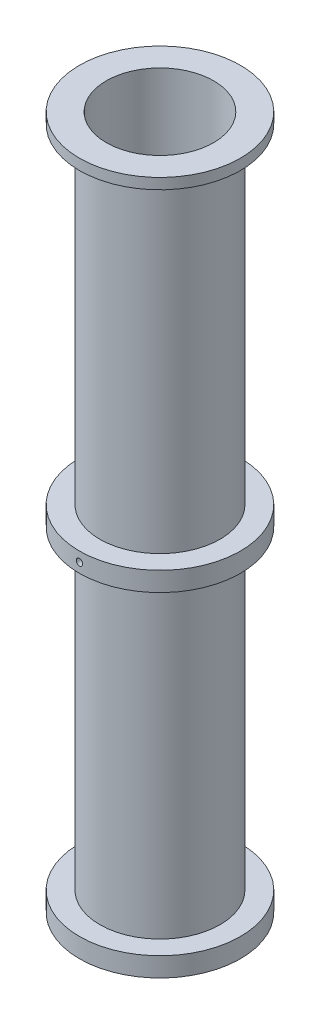
ISO-10303-21;
HEADER;
FILE_DESCRIPTION(('STEP AP214'),'2;1');
FILE_NAME('part.step','',(''),(''),'','','');
FILE_SCHEMA(('AUTOMOTIVE_DESIGN { 1 0 10303 214 1 1 1 1 }'));
ENDSEC;
DATA;
#1=APPLICATION_CONTEXT('core data for automotive mechanical design processes');
#2=APPLICATION_PROTOCOL_DEFINITION('international standard','automotive_design',2000,#1);
#3=PRODUCT_CONTEXT('',#1,'mechanical');
#4=PRODUCT('Part','Part','',(#3));
#5=PRODUCT_RELATED_PRODUCT_CATEGORY('part','',(#4));
#6=PRODUCT_DEFINITION_FORMATION('','',#4);
#7=PRODUCT_DEFINITION_CONTEXT('part definition',#1,'design');
#8=PRODUCT_DEFINITION('design','',#6,#7);
#9=PRODUCT_DEFINITION_SHAPE('','',#8);
#10=(LENGTH_UNIT() NAMED_UNIT(*) SI_UNIT(.MILLI.,.METRE.));
#11=(NAMED_UNIT(*) PLANE_ANGLE_UNIT() SI_UNIT($,.RADIAN.));
#12=(NAMED_UNIT(*) SI_UNIT($,.STERADIAN.) SOLID_ANGLE_UNIT());
#13=UNCERTAINTY_MEASURE_WITH_UNIT(LENGTH_MEASURE(1.E-05),#10,'distance_accuracy_value','');
#14=(GEOMETRIC_REPRESENTATION_CONTEXT(3) GLOBAL_UNCERTAINTY_ASSIGNED_CONTEXT((#13)) GLOBAL_UNIT_ASSIGNED_CONTEXT((#10,
#11,#12)) REPRESENTATION_CONTEXT('',''));
#15=CARTESIAN_POINT('',(0.,0.,0.));
#16=DIRECTION('',(0.,0.,1.));
#17=DIRECTION('',(1.,0.,0.));
#18=AXIS2_PLACEMENT_3D('',#15,#16,#17);
#19=CARTESIAN_POINT('',(0.,0.,0.));
#20=DIRECTION('',(0.,-1.,0.));
#21=DIRECTION('',(0.,0.,-1.));
#22=AXIS2_PLACEMENT_3D('',#19,#20,#21);
#23=PLANE('',#22);
#24=CARTESIAN_POINT('',(0.,0.,0.));
#25=DIRECTION('',(0.,1.,0.));
#26=DIRECTION('',(0.,0.,1.));
#27=AXIS2_PLACEMENT_3D('',#24,#25,#26);
#28=CIRCLE('',#27,37.5);
#29=CARTESIAN_POINT('',(0.,0.,37.5));
#30=VERTEX_POINT('',#29);
#31=EDGE_CURVE('E10',#30,#30,#28,.T.);
#32=ORIENTED_EDGE('',*,*,#31,.F.);
#33=EDGE_LOOP('',(#32));
#34=FACE_BOUND('',#33,.T.);
#35=ADVANCED_FACE('F34',(#34),#23,.T.);
#36=CARTESIAN_POINT('',(0.,3.,0.));
#37=DIRECTION('',(0.,1.,0.));
#38=DIRECTION('',(0.,0.,1.));
#39=AXIS2_PLACEMENT_3D('',#36,#37,#38);
#40=CYLINDRICAL_SURFACE('',#39,37.5);
#41=ORIENTED_EDGE('',*,*,#31,.T.);
#42=EDGE_LOOP('',(#41));
#43=FACE_BOUND('',#42,.T.);
#44=CARTESIAN_POINT('',(0.,8.99999999999999,0.));
#45=DIRECTION('',(0.,1.,0.));
#46=DIRECTION('',(0.,0.,1.));
#47=AXIS2_PLACEMENT_3D('',#44,#45,#46);
#48=CIRCLE('',#47,37.5);
#49=CARTESIAN_POINT('',(0.,8.99999999999999,37.5));
#50=VERTEX_POINT('',#49);
#51=EDGE_CURVE('E40',#50,#50,#48,.T.);
#52=ORIENTED_EDGE('',*,*,#51,.F.);
#53=EDGE_LOOP('',(#52));
#54=FACE_BOUND('',#53,.T.);
#55=ADVANCED_FACE('F178',(#43,#54),#40,.T.);
#56=CARTESIAN_POINT('',(0.,8.99999999999999,37.5));
#57=DIRECTION('',(0.,1.,0.));
#58=DIRECTION('',(0.,0.,1.));
#59=AXIS2_PLACEMENT_3D('',#56,#57,#58);
#60=PLANE('',#59);
#61=ORIENTED_EDGE('',*,*,#51,.T.);
#62=EDGE_LOOP('',(#61));
#63=FACE_BOUND('',#62,.T.);
#64=CARTESIAN_POINT('',(0.,8.99999999999999,0.));
#65=DIRECTION('',(0.,1.,0.));
#66=DIRECTION('',(0.,0.,1.));
#67=AXIS2_PLACEMENT_3D('',#64,#65,#66);
#68=CIRCLE('',#67,28.);
#69=CARTESIAN_POINT('',(0.,8.99999999999999,28.));
#70=VERTEX_POINT('',#69);
#71=EDGE_CURVE('E44',#70,#70,#68,.T.);
#72=ORIENTED_EDGE('',*,*,#71,.F.);
#73=EDGE_LOOP('',(#72));
#74=FACE_BOUND('',#73,.T.);
#75=ADVANCED_FACE('F183',(#63,#74),#60,.T.);
#76=CARTESIAN_POINT('',(0.,3.,0.));
#77=DIRECTION('',(0.,1.,0.));
#78=DIRECTION('',(0.,0.,1.));
#79=AXIS2_PLACEMENT_3D('',#76,#77,#78);
#80=CYLINDRICAL_SURFACE('',#79,28.);
#81=ORIENTED_EDGE('',*,*,#71,.T.);
#82=EDGE_LOOP('',(#81));
#83=FACE_BOUND('',#82,.T.);
#84=CARTESIAN_POINT('',(0.,155.5,0.));
#85=DIRECTION('',(0.,1.,0.));
#86=DIRECTION('',(0.,0.,1.));
#87=AXIS2_PLACEMENT_3D('',#84,#85,#86);
#88=CIRCLE('',#87,28.);
#89=CARTESIAN_POINT('',(0.,155.5,28.));
#90=VERTEX_POINT('',#89);
#91=EDGE_CURVE('E48',#90,#90,#88,.T.);
#92=ORIENTED_EDGE('',*,*,#91,.F.);
#93=EDGE_LOOP('',(#92));
#94=FACE_BOUND('',#93,.T.);
#95=ADVANCED_FACE('F187',(#83,#94),#80,.T.);
#96=CARTESIAN_POINT('',(0.,155.5,37.5));
#97=DIRECTION('',(0.,-1.,0.));
#98=DIRECTION('',(0.,0.,-1.));
#99=AXIS2_PLACEMENT_3D('',#96,#97,#98);
#100=PLANE('',#99);
#101=ORIENTED_EDGE('',*,*,#91,.T.);
#102=EDGE_LOOP('',(#101));
#103=FACE_BOUND('',#102,.T.);
#104=CARTESIAN_POINT('',(0.,155.5,0.));
#105=DIRECTION('',(0.,1.,0.));
#106=DIRECTION('',(0.,0.,1.));
#107=AXIS2_PLACEMENT_3D('',#104,#105,#106);
#108=CIRCLE('',#107,37.5);
#109=CARTESIAN_POINT('',(0.,155.5,37.5));
#110=VERTEX_POINT('',#109);
#111=EDGE_CURVE('E53',#110,#110,#108,.T.);
#112=ORIENTED_EDGE('',*,*,#111,.F.);
#113=EDGE_LOOP('',(#112));
#114=FACE_BOUND('',#113,.T.);
#115=ADVANCED_FACE('F127',(#103,#114),#100,.T.);
#116=CARTESIAN_POINT('',(0.,3.,0.));
#117=DIRECTION('',(0.,1.,0.));
#118=DIRECTION('',(0.,0.,1.));
#119=AXIS2_PLACEMENT_3D('',#116,#117,#118);
#120=CYLINDRICAL_SURFACE('',#119,37.5);
#121=CARTESIAN_POINT('',(0.,158.5,37.5));
#122=CARTESIAN_POINT('',(-0.0842195205141671,158.500003723576,37.4999995970403));
#123=CARTESIAN_POINT('',(-0.1684992501374,158.507116742075,37.4997132414617));
#124=CARTESIAN_POINT('',(-0.334735123578592,158.535391889686,37.49859844096));
#125=CARTESIAN_POINT('',(-0.416688387770324,158.55657070054,37.4977693523835));
#126=CARTESIAN_POINT('',(-0.5758390943498,158.612371334294,37.4956629547055));
#127=CARTESIAN_POINT('',(-0.653038883672903,158.646986460603,37.494385868914));
#128=CARTESIAN_POINT('',(-0.800510699850159,158.72866721925,37.4915274322161));
#129=CARTESIAN_POINT('',(-0.870784387851939,158.775729856169,37.4899461545366));
#130=CARTESIAN_POINT('',(-1.00247959646428,158.881007024338,37.4866560761337));
#131=CARTESIAN_POINT('',(-1.06389574767865,158.939228270501,37.4849471990047));
#132=CARTESIAN_POINT('',(-1.17608696497184,159.065157175771,37.4815951879592));
#133=CARTESIAN_POINT('',(-1.22686160254644,159.132865216703,37.4799520566921));
#134=CARTESIAN_POINT('',(-1.31634095076994,159.27587089146,37.476916346263));
#135=CARTESIAN_POINT('',(-1.35504182416198,159.351170928116,37.4755238468156));
#136=CARTESIAN_POINT('',(-1.41925034146144,159.507206113214,37.4731472754128));
#137=CARTESIAN_POINT('',(-1.4447580588977,159.587941231362,37.4721632011813));
#138=CARTESIAN_POINT('',(-1.48184297398315,159.752508621628,37.4707150888233));
#139=CARTESIAN_POINT('',(-1.49342768712381,159.836339197638,37.4702507701475));
#140=CARTESIAN_POINT('',(-1.50236092028189,160.004756366492,37.4698936828178));
#141=CARTESIAN_POINT('',(-1.49970952140344,160.089342955026,37.4700009109076));
#142=CARTESIAN_POINT('',(-1.4802520873987,160.256820030199,37.4707745642131));
#143=CARTESIAN_POINT('',(-1.46345416964689,160.339711461599,37.4714406687405));
#144=CARTESIAN_POINT('',(-1.41619309835374,160.501496961978,37.4732564860408));
#145=CARTESIAN_POINT('',(-1.38572990260151,160.58039101861,37.4744062003074));
#146=CARTESIAN_POINT('',(-1.31199371358753,160.731968418156,37.477060011414));
#147=CARTESIAN_POINT('',(-1.26871700804404,160.804649953326,37.4785642109282));
#148=CARTESIAN_POINT('',(-1.17058499130181,160.941719353547,37.4817573316246));
#149=CARTESIAN_POINT('',(-1.1157296294568,161.006107182319,37.4834462536147));
#150=CARTESIAN_POINT('',(-0.995951575481959,161.124808698738,37.4868198688846));
#151=CARTESIAN_POINT('',(-0.931021849917455,161.179115289523,37.488504558368));
#152=CARTESIAN_POINT('',(-0.792962951803446,161.276058106275,37.4916786663144));
#153=CARTESIAN_POINT('',(-0.719833777660065,161.318694329974,37.4931680847395));
#154=CARTESIAN_POINT('',(-0.567447811905341,161.391085386012,37.4957838089156));
#155=CARTESIAN_POINT('',(-0.488190909022632,161.420839984373,37.4969101080708));
#156=CARTESIAN_POINT('',(-0.325801101121311,161.466618588044,37.4986725418978));
#157=CARTESIAN_POINT('',(-0.242668214731312,161.482642659337,37.4993086789251));
#158=CARTESIAN_POINT('',(-0.0749479203356583,161.500496625732,37.500018784703));
#159=CARTESIAN_POINT('',(0.00963844090902377,161.502336339347,37.5000931423206));
#160=CARTESIAN_POINT('',(0.177918750101981,161.491794970416,37.4996723393137));
#161=CARTESIAN_POINT('',(0.261612699921769,161.4794139177,37.4991771798839));
#162=CARTESIAN_POINT('',(0.425704989343062,161.440790594783,37.497673383271));
#163=CARTESIAN_POINT('',(0.506104382512182,161.41455279371,37.4966649116469));
#164=CARTESIAN_POINT('',(0.661357713474356,161.348965300032,37.4942480862364));
#165=CARTESIAN_POINT('',(0.736211630990282,161.309615559487,37.492839730988));
#166=CARTESIAN_POINT('',(0.878294330894828,161.218895959408,37.4897807254159));
#167=CARTESIAN_POINT('',(0.945518898362466,161.167519503116,37.4881299423042));
#168=CARTESIAN_POINT('',(1.07039228732311,161.054214524942,37.4847725098235));
#169=CARTESIAN_POINT('',(1.12804106822738,160.992285958335,37.4830658602176));
#170=CARTESIAN_POINT('',(1.23215935801066,160.859592533953,37.4797879672503));
#171=CARTESIAN_POINT('',(1.27862252455697,160.788822697486,37.4782168010316));
#172=CARTESIAN_POINT('',(1.35900732485935,160.640480901288,37.4753882409257));
#173=CARTESIAN_POINT('',(1.39292899844216,160.56290896316,37.4741308460422));
#174=CARTESIAN_POINT('',(1.44725680335506,160.403188657132,37.472072157233));
#175=CARTESIAN_POINT('',(1.46766701149935,160.321041677776,37.4712707257398));
#176=CARTESIAN_POINT('',(1.49440586308033,160.154483595663,37.470213942613));
#177=CARTESIAN_POINT('',(1.50073454840028,160.070072499641,37.4699585893553));
#178=CARTESIAN_POINT('',(1.49913024560453,159.901445556699,37.4700228038771));
#179=CARTESIAN_POINT('',(1.49120724398331,159.817229614432,37.470341969078));
#180=CARTESIAN_POINT('',(1.4613450668606,159.651324384802,37.4715183952149));
#181=CARTESIAN_POINT('',(1.43940586398703,159.569635102374,37.4723756572015));
#182=CARTESIAN_POINT('',(1.3821358583777,159.411099324305,37.4745315659041));
#183=CARTESIAN_POINT('',(1.34680487429427,159.334252894262,37.4758302185971));
#184=CARTESIAN_POINT('',(1.26375649376227,159.187582925539,37.4787224740583));
#185=CARTESIAN_POINT('',(1.21603951547729,159.117759149879,37.4803160668684));
#186=CARTESIAN_POINT('',(1.10953987625872,158.987067904014,37.4836197988814));
#187=CARTESIAN_POINT('',(1.05075066767261,158.92620577149,37.4853300066618));
#188=CARTESIAN_POINT('',(0.923771927333156,158.815197203434,37.4886738914741));
#189=CARTESIAN_POINT('',(0.855580078196107,158.765053417349,37.490307549506));
#190=CARTESIAN_POINT('',(0.711693425952757,158.676889942843,37.4933150207665));
#191=CARTESIAN_POINT('',(0.635992790975171,158.638879776462,37.4946886295751));
#192=CARTESIAN_POINT('',(0.479336523753521,158.576153338983,37.4970178490855));
#193=CARTESIAN_POINT('',(0.398387260770486,158.55142128105,37.4979739559171));
#194=CARTESIAN_POINT('',(0.264108572909723,158.522478097612,37.4991060596921));
#195=CARTESIAN_POINT('',(0.211649948068835,158.514059485052,37.4994398246029));
#196=CARTESIAN_POINT('',(0.106135520704444,158.502819264339,37.4998869216816));
#197=CARTESIAN_POINT('',(0.0530797184995046,158.4999976532,37.5000002539671));
#198=CARTESIAN_POINT('',(0.,158.5,37.5));
#199=B_SPLINE_CURVE_WITH_KNOTS('',3,(#121,#122,#123,#124,#125,#126,#127,#128,#129,#130,#131,
#132,#133,#134,#135,#136,#137,#138,#139,#140,#141,#142,#143,#144,#145,#146,#147,#148,#149,#150,
#151,#152,#153,#154,#155,#156,#157,#158,#159,#160,#161,#162,#163,#164,#165,#166,#167,#168,#169,
#170,#171,#172,#173,#174,#175,#176,#177,#178,#179,#180,#181,#182,#183,#184,#185,#186,#187,#188,
#189,#190,#191,#192,#193,#194,#195,#196,#197,#198),.UNSPECIFIED.,.T.,.F.,(4,2,2,2,2,2,2,2,2,2,2,
2,2,2,2,2,2,2,2,2,2,2,2,2,2,2,2,2,2,2,2,2,2,2,2,2,2,2,4),(0.,0.252464808076155,
0.505229570212395,0.757868517098838,1.01044672316359,1.26317740309555,1.51591825783642,
1.76873935647587,2.02155904606319,2.27424220485604,2.52692392409683,2.7794607514579,
3.03199835888937,3.2846092022746,3.53722115062903,3.79001026067344,4.04279941985713,
4.29559317043277,4.54838570616527,4.80100324139001,5.05362024673577,5.30615582689219,
5.55869233040376,5.81136767831599,6.06404409721172,6.31686344998805,6.56968199990472,
6.82242423207415,7.07516571250095,7.32773015997397,7.58029510067838,7.83286346166716,
8.08542329680364,8.33813295687006,8.59090501169826,8.84387494828978,9.09654344971404,
9.25566057612588,9.41477761766092),.UNSPECIFIED.);
#200=CARTESIAN_POINT('',(0.,158.5,37.5));
#201=VERTEX_POINT('',#200);
#202=EDGE_CURVE('E106',#201,#201,#199,.T.);
#203=ORIENTED_EDGE('',*,*,#202,.T.);
#204=EDGE_LOOP('',(#203));
#205=FACE_BOUND('',#204,.T.);
#206=CARTESIAN_POINT('',(0.,161.5,-37.5));
#207=CARTESIAN_POINT('',(-0.0842195205141672,161.499996276424,-37.4999995970404));
#208=CARTESIAN_POINT('',(-0.1684992501374,161.492883257925,-37.4997132414617));
#209=CARTESIAN_POINT('',(-0.334735123578592,161.464608110314,-37.49859844096));
#210=CARTESIAN_POINT('',(-0.416688387770324,161.44342929946,-37.4977693523835));
#211=CARTESIAN_POINT('',(-0.5758390943498,161.387628665706,-37.4956629547055));
#212=CARTESIAN_POINT('',(-0.653038883672903,161.353013539397,-37.494385868914));
#213=CARTESIAN_POINT('',(-0.800510699850159,161.27133278075,-37.4915274322161));
#214=CARTESIAN_POINT('',(-0.870784387851939,161.224270143831,-37.4899461545366));
#215=CARTESIAN_POINT('',(-1.00247959646428,161.118992975662,-37.4866560761337));
#216=CARTESIAN_POINT('',(-1.06389574767865,161.060771729499,-37.4849471990048));
#217=CARTESIAN_POINT('',(-1.17608696497184,160.934842824229,-37.4815951879592));
#218=CARTESIAN_POINT('',(-1.22686160254644,160.867134783297,-37.4799520566921));
#219=CARTESIAN_POINT('',(-1.31634095076994,160.72412910854,-37.476916346263));
#220=CARTESIAN_POINT('',(-1.35504182416198,160.648829071884,-37.4755238468156));
#221=CARTESIAN_POINT('',(-1.41925034146144,160.492793886786,-37.4731472754129));
#222=CARTESIAN_POINT('',(-1.4447580588977,160.412058768638,-37.4721632011813));
#223=CARTESIAN_POINT('',(-1.48184297398315,160.247491378372,-37.4707150888233));
#224=CARTESIAN_POINT('',(-1.49342768712381,160.163660802362,-37.4702507701475));
#225=CARTESIAN_POINT('',(-1.50236092028189,159.995243633508,-37.4698936828178));
#226=CARTESIAN_POINT('',(-1.49970952140344,159.910657044974,-37.4700009109077));
#227=CARTESIAN_POINT('',(-1.4802520873987,159.743179969801,-37.4707745642131));
#228=CARTESIAN_POINT('',(-1.46345416964689,159.660288538401,-37.4714406687406));
#229=CARTESIAN_POINT('',(-1.41619309835375,159.498503038022,-37.4732564860408));
#230=CARTESIAN_POINT('',(-1.38572990260151,159.41960898139,-37.4744062003075));
#231=CARTESIAN_POINT('',(-1.31199371358753,159.268031581844,-37.477060011414));
#232=CARTESIAN_POINT('',(-1.26871700804404,159.195350046674,-37.4785642109283));
#233=CARTESIAN_POINT('',(-1.17058499130181,159.058280646453,-37.4817573316246));
#234=CARTESIAN_POINT('',(-1.1157296294568,158.993892817681,-37.4834462536148));
#235=CARTESIAN_POINT('',(-0.995951575481959,158.875191301262,-37.4868198688846));
#236=CARTESIAN_POINT('',(-0.931021849917455,158.820884710477,-37.488504558368));
#237=CARTESIAN_POINT('',(-0.792962951803446,158.723941893725,-37.4916786663144));
#238=CARTESIAN_POINT('',(-0.719833777660065,158.681305670026,-37.4931680847396));
#239=CARTESIAN_POINT('',(-0.567447811905341,158.608914613988,-37.4957838089156));
#240=CARTESIAN_POINT('',(-0.488190909022632,158.579160015627,-37.4969101080709));
#241=CARTESIAN_POINT('',(-0.325801101121311,158.533381411956,-37.4986725418979));
#242=CARTESIAN_POINT('',(-0.242668214731312,158.517357340663,-37.4993086789252));
#243=CARTESIAN_POINT('',(-0.0749479203356578,158.499503374268,-37.5000187847031));
#244=CARTESIAN_POINT('',(0.00963844090902494,158.497663660653,-37.5000931423206));
#245=CARTESIAN_POINT('',(0.177918750101982,158.508205029584,-37.4996723393137));
#246=CARTESIAN_POINT('',(0.261612699921769,158.5205860823,-37.499177179884));
#247=CARTESIAN_POINT('',(0.425704989343062,158.559209405217,-37.497673383271));
#248=CARTESIAN_POINT('',(0.506104382512182,158.58544720629,-37.4966649116469));
#249=CARTESIAN_POINT('',(0.661357713474356,158.651034699968,-37.4942480862365));
#250=CARTESIAN_POINT('',(0.736211630990282,158.690384440513,-37.492839730988));
#251=CARTESIAN_POINT('',(0.878294330894828,158.781104040592,-37.4897807254159));
#252=CARTESIAN_POINT('',(0.945518898362466,158.832480496884,-37.4881299423042));
#253=CARTESIAN_POINT('',(1.07039228732311,158.945785475058,-37.4847725098235));
#254=CARTESIAN_POINT('',(1.12804106822738,159.007714041665,-37.4830658602177));
#255=CARTESIAN_POINT('',(1.23215935801066,159.140407466047,-37.4797879672504));
#256=CARTESIAN_POINT('',(1.27862252455697,159.211177302514,-37.4782168010316));
#257=CARTESIAN_POINT('',(1.35900732485935,159.359519098712,-37.4753882409258));
#258=CARTESIAN_POINT('',(1.39292899844216,159.43709103684,-37.4741308460422));
#259=CARTESIAN_POINT('',(1.44725680335506,159.596811342868,-37.4720721572331));
#260=CARTESIAN_POINT('',(1.46766701149935,159.678958322224,-37.4712707257398));
#261=CARTESIAN_POINT('',(1.49440586308033,159.845516404337,-37.470213942613));
#262=CARTESIAN_POINT('',(1.50073454840028,159.929927500359,-37.4699585893553));
#263=CARTESIAN_POINT('',(1.49913024560453,160.098554443301,-37.4700228038771));
#264=CARTESIAN_POINT('',(1.49120724398331,160.182770385568,-37.4703419690781));
#265=CARTESIAN_POINT('',(1.4613450668606,160.348675615198,-37.4715183952149));
#266=CARTESIAN_POINT('',(1.43940586398703,160.430364897627,-37.4723756572016));
#267=CARTESIAN_POINT('',(1.3821358583777,160.588900675695,-37.4745315659042));
#268=CARTESIAN_POINT('',(1.34680487429427,160.665747105738,-37.4758302185972));
#269=CARTESIAN_POINT('',(1.26375649376227,160.812417074461,-37.4787224740583));
#270=CARTESIAN_POINT('',(1.21603951547729,160.882240850121,-37.4803160668685));
#271=CARTESIAN_POINT('',(1.10953987625872,161.012932095986,-37.4836197988815));
#272=CARTESIAN_POINT('',(1.05075066767261,161.07379422851,-37.4853300066618));
#273=CARTESIAN_POINT('',(0.923771927333156,161.184802796566,-37.4886738914741));
#274=CARTESIAN_POINT('',(0.855580078196105,161.234946582651,-37.4903075495061));
#275=CARTESIAN_POINT('',(0.711693425952751,161.323110057157,-37.4933150207665));
#276=CARTESIAN_POINT('',(0.635992790975161,161.361120223538,-37.4946886295751));
#277=CARTESIAN_POINT('',(0.47933652375351,161.423846661017,-37.4970178490855));
#278=CARTESIAN_POINT('',(0.398387260770479,161.44857871895,-37.4979739559171));
#279=CARTESIAN_POINT('',(0.264108572909722,161.477521902388,-37.4991060596921));
#280=CARTESIAN_POINT('',(0.211649948068835,161.485940514948,-37.499439824603));
#281=CARTESIAN_POINT('',(0.106135520704445,161.497180735661,-37.4998869216817));
#282=CARTESIAN_POINT('',(0.0530797184995047,161.5000023468,-37.5000002539671));
#283=CARTESIAN_POINT('',(0.,161.5,-37.5));
#284=B_SPLINE_CURVE_WITH_KNOTS('',3,(#206,#207,#208,#209,#210,#211,#212,#213,#214,#215,#216,
#217,#218,#219,#220,#221,#222,#223,#224,#225,#226,#227,#228,#229,#230,#231,#232,#233,#234,#235,
#236,#237,#238,#239,#240,#241,#242,#243,#244,#245,#246,#247,#248,#249,#250,#251,#252,#253,#254,
#255,#256,#257,#258,#259,#260,#261,#262,#263,#264,#265,#266,#267,#268,#269,#270,#271,#272,#273,
#274,#275,#276,#277,#278,#279,#280,#281,#282,#283),.UNSPECIFIED.,.T.,.F.,(4,2,2,2,2,2,2,2,2,2,2,
2,2,2,2,2,2,2,2,2,2,2,2,2,2,2,2,2,2,2,2,2,2,2,2,2,2,2,4),(0.,0.252464808076155,
0.505229570212395,0.757868517098838,1.01044672316359,1.26317740309555,1.51591825783642,
1.76873935647587,2.02155904606319,2.27424220485607,2.52692392409683,2.77946075145787,
3.03199835888937,3.2846092022746,3.53722115062903,3.79001026067344,4.04279941985713,
4.29559317043277,4.54838570616527,4.80100324139001,5.05362024673577,5.30615582689219,
5.55869233040376,5.81136767831599,6.06404409721172,6.31686344998805,6.56968199990472,
6.82242423207415,7.07516571250095,7.32773015997397,7.58029510067838,7.83286346166716,
8.08542329680364,8.33813295687006,8.59090501169826,8.84387494828981,9.09654344971405,
9.25566057612589,9.41477761766093),.UNSPECIFIED.);
#285=CARTESIAN_POINT('',(0.,161.5,-37.5));
#286=VERTEX_POINT('',#285);
#287=EDGE_CURVE('E85',#286,#286,#284,.T.);
#288=ORIENTED_EDGE('',*,*,#287,.T.);
#289=EDGE_LOOP('',(#288));
#290=FACE_BOUND('',#289,.T.);
#291=ORIENTED_EDGE('',*,*,#111,.T.);
#292=EDGE_LOOP('',(#291));
#293=FACE_BOUND('',#292,.T.);
#294=CARTESIAN_POINT('',(0.,164.5,0.));
#295=DIRECTION('',(0.,1.,0.));
#296=DIRECTION('',(0.,0.,1.));
#297=AXIS2_PLACEMENT_3D('',#294,#295,#296);
#298=CIRCLE('',#297,37.5);
#299=CARTESIAN_POINT('',(0.,164.5,37.5));
#300=VERTEX_POINT('',#299);
#301=EDGE_CURVE('E56',#300,#300,#298,.T.);
#302=ORIENTED_EDGE('',*,*,#301,.F.);
#303=EDGE_LOOP('',(#302));
#304=FACE_BOUND('',#303,.T.);
#305=ADVANCED_FACE('F122',(#205,#290,#293,#304),#120,.T.);
#306=CARTESIAN_POINT('',(0.,164.5,28.));
#307=DIRECTION('',(0.,1.,0.));
#308=DIRECTION('',(0.,0.,1.));
#309=AXIS2_PLACEMENT_3D('',#306,#307,#308);
#310=PLANE('',#309);
#311=ORIENTED_EDGE('',*,*,#301,.T.);
#312=EDGE_LOOP('',(#311));
#313=FACE_BOUND('',#312,.T.);
#314=CARTESIAN_POINT('',(0.,164.5,0.));
#315=DIRECTION('',(0.,1.,0.));
#316=DIRECTION('',(0.,0.,1.));
#317=AXIS2_PLACEMENT_3D('',#314,#315,#316);
#318=CIRCLE('',#317,28.);
#319=CARTESIAN_POINT('',(0.,164.5,28.));
#320=VERTEX_POINT('',#319);
#321=EDGE_CURVE('E59',#320,#320,#318,.T.);
#322=ORIENTED_EDGE('',*,*,#321,.F.);
#323=EDGE_LOOP('',(#322));
#324=FACE_BOUND('',#323,.T.);
#325=ADVANCED_FACE('F126',(#313,#324),#310,.T.);
#326=CARTESIAN_POINT('',(0.,3.,0.));
#327=DIRECTION('',(0.,1.,0.));
#328=DIRECTION('',(0.,0.,1.));
#329=AXIS2_PLACEMENT_3D('',#326,#327,#328);
#330=CYLINDRICAL_SURFACE('',#329,28.);
#331=ORIENTED_EDGE('',*,*,#321,.T.);
#332=EDGE_LOOP('',(#331));
#333=FACE_BOUND('',#332,.T.);
#334=CARTESIAN_POINT('',(0.,318.,0.));
#335=DIRECTION('',(0.,1.,0.));
#336=DIRECTION('',(0.,0.,1.));
#337=AXIS2_PLACEMENT_3D('',#334,#335,#336);
#338=CIRCLE('',#337,28.);
#339=CARTESIAN_POINT('',(0.,318.,28.));
#340=VERTEX_POINT('',#339);
#341=EDGE_CURVE('E62',#340,#340,#338,.T.);
#342=ORIENTED_EDGE('',*,*,#341,.F.);
#343=EDGE_LOOP('',(#342));
#344=FACE_BOUND('',#343,.T.);
#345=ADVANCED_FACE('F137',(#333,#344),#330,.T.);
#346=CARTESIAN_POINT('',(0.,318.,37.5));
#347=DIRECTION('',(0.,-1.,0.));
#348=DIRECTION('',(0.,0.,-1.));
#349=AXIS2_PLACEMENT_3D('',#346,#347,#348);
#350=PLANE('',#349);
#351=ORIENTED_EDGE('',*,*,#341,.T.);
#352=EDGE_LOOP('',(#351));
#353=FACE_BOUND('',#352,.T.);
#354=CARTESIAN_POINT('',(0.,318.,0.));
#355=DIRECTION('',(0.,1.,0.));
#356=DIRECTION('',(0.,0.,1.));
#357=AXIS2_PLACEMENT_3D('',#354,#355,#356);
#358=CIRCLE('',#357,37.5);
#359=CARTESIAN_POINT('',(0.,318.,37.5));
#360=VERTEX_POINT('',#359);
#361=EDGE_CURVE('E65',#360,#360,#358,.T.);
#362=ORIENTED_EDGE('',*,*,#361,.F.);
#363=EDGE_LOOP('',(#362));
#364=FACE_BOUND('',#363,.T.);
#365=ADVANCED_FACE('F143',(#353,#364),#350,.T.);
#366=CARTESIAN_POINT('',(0.,3.,0.));
#367=DIRECTION('',(0.,1.,0.));
#368=DIRECTION('',(0.,0.,1.));
#369=AXIS2_PLACEMENT_3D('',#366,#367,#368);
#370=CYLINDRICAL_SURFACE('',#369,37.5);
#371=ORIENTED_EDGE('',*,*,#361,.T.);
#372=EDGE_LOOP('',(#371));
#373=FACE_BOUND('',#372,.T.);
#374=CARTESIAN_POINT('',(0.,323.,0.));
#375=DIRECTION('',(0.,1.,0.));
#376=DIRECTION('',(0.,0.,1.));
#377=AXIS2_PLACEMENT_3D('',#374,#375,#376);
#378=CIRCLE('',#377,37.5);
#379=CARTESIAN_POINT('',(0.,323.,37.5));
#380=VERTEX_POINT('',#379);
#381=EDGE_CURVE('E68',#380,#380,#378,.T.);
#382=ORIENTED_EDGE('',*,*,#381,.F.);
#383=EDGE_LOOP('',(#382));
#384=FACE_BOUND('',#383,.T.);
#385=ADVANCED_FACE('F149',(#373,#384),#370,.T.);
#386=CARTESIAN_POINT('',(0.,323.,37.5));
#387=DIRECTION('',(0.,1.,0.));
#388=DIRECTION('',(0.,0.,1.));
#389=AXIS2_PLACEMENT_3D('',#386,#387,#388);
#390=PLANE('',#389);
#391=ORIENTED_EDGE('',*,*,#381,.T.);
#392=EDGE_LOOP('',(#391));
#393=FACE_BOUND('',#392,.T.);
#394=CARTESIAN_POINT('',(0.,323.,0.));
#395=DIRECTION('',(0.,1.,0.));
#396=DIRECTION('',(0.,0.,1.));
#397=AXIS2_PLACEMENT_3D('',#394,#395,#396);
#398=CIRCLE('',#397,25.0000000000001);
#399=CARTESIAN_POINT('',(0.,323.,25.));
#400=VERTEX_POINT('',#399);
#401=EDGE_CURVE('E71',#400,#400,#398,.T.);
#402=ORIENTED_EDGE('',*,*,#401,.F.);
#403=EDGE_LOOP('',(#402));
#404=FACE_BOUND('',#403,.T.);
#405=ADVANCED_FACE('F155',(#393,#404),#390,.T.);
#406=CARTESIAN_POINT('',(0.,3.,0.));
#407=DIRECTION('',(0.,1.,0.));
#408=DIRECTION('',(0.,0.,1.));
#409=AXIS2_PLACEMENT_3D('',#406,#407,#408);
#410=CYLINDRICAL_SURFACE('',#409,25.);
#411=CARTESIAN_POINT('',(0.,158.5,25.));
#412=CARTESIAN_POINT('',(0.084174411290698,158.500003706182,24.9999994009396));
#413=CARTESIAN_POINT('',(0.168407925575419,158.507109137706,24.9995703322505));
#414=CARTESIAN_POINT('',(0.334549549235282,158.53535239157,24.9978999420123));
#415=CARTESIAN_POINT('',(0.416454828330712,158.556506590122,24.9966576725644));
#416=CARTESIAN_POINT('',(0.575509331027305,158.612238014884,24.9935014300757));
#417=CARTESIAN_POINT('',(0.652661020509569,158.646808212567,24.9915878088007));
#418=CARTESIAN_POINT('',(0.800046136146105,158.728379048056,24.9873041548427));
#419=CARTESIAN_POINT('',(0.870281152186777,158.775376820027,24.9849342274195));
#420=CARTESIAN_POINT('',(1.00195727834145,158.880540572873,24.9800007098428));
#421=CARTESIAN_POINT('',(1.0633875072824,158.938720168272,24.9774368859408));
#422=CARTESIAN_POINT('',(1.17561728443769,159.064568149316,24.9724065327507));
#423=CARTESIAN_POINT('',(1.22641639063194,159.132236929305,24.9699400075116));
#424=CARTESIAN_POINT('',(1.31597486784903,159.275203278262,24.9653806252969));
#425=CARTESIAN_POINT('',(1.35472528905779,159.350506463304,24.9632880465788));
#426=CARTESIAN_POINT('',(1.41902912258917,159.506564639576,24.9597155336563));
#427=CARTESIAN_POINT('',(1.44458266771712,159.587319575933,24.9582355932869));
#428=CARTESIAN_POINT('',(1.48173741565119,159.751884857935,24.9560574575134));
#429=CARTESIAN_POINT('',(1.49335553999939,159.835691370366,24.9553583140724));
#430=CARTESIAN_POINT('',(1.50236188160073,160.004067779898,24.954817773996));
#431=CARTESIAN_POINT('',(1.49975024936642,160.088637668915,24.954976368288));
#432=CARTESIAN_POINT('',(1.48038526467146,160.25602496258,24.9561325386846));
#433=CARTESIAN_POINT('',(1.46365021721639,160.33884449347,24.9571290288072));
#434=CARTESIAN_POINT('',(1.41654183568936,160.500496759168,24.9598469788447));
#435=CARTESIAN_POINT('',(1.38616842513187,160.579329471616,24.9615684428253));
#436=CARTESIAN_POINT('',(1.31262469930025,160.730829173204,24.9655435872457));
#437=CARTESIAN_POINT('',(1.26944607125189,160.803492117574,24.9677976132154));
#438=CARTESIAN_POINT('',(1.17152362364147,160.94054542463,24.9725835122349));
#439=CARTESIAN_POINT('',(1.11677968459202,161.004935701836,24.9751153881552));
#440=CARTESIAN_POINT('',(0.997177453913967,161.123722381079,24.9801764756538));
#441=CARTESIAN_POINT('',(0.93230331834646,161.178102832126,24.9827056767018));
#442=CARTESIAN_POINT('',(0.794337807078344,161.275203187104,24.9874725341813));
#443=CARTESIAN_POINT('',(0.721246428711373,161.317923087251,24.9897101905182));
#444=CARTESIAN_POINT('',(0.568911628096259,161.390488290007,24.9936419598513));
#445=CARTESIAN_POINT('',(0.489667922304723,161.42033299882,24.9953360477775));
#446=CARTESIAN_POINT('',(0.327282186584157,161.466290031572,24.9979894319355));
#447=CARTESIAN_POINT('',(0.244140198631621,161.482402503343,24.9989487360775));
#448=CARTESIAN_POINT('',(0.0764564081212722,161.500417945962,25.0000234317371));
#449=CARTESIAN_POINT('',(-0.00808301680837477,161.502342972575,25.000140133157));
#450=CARTESIAN_POINT('',(-0.176283598525665,161.491986493457,24.9995199551995));
#451=CARTESIAN_POINT('',(-0.25994475951849,161.479705055779,24.998783079911));
#452=CARTESIAN_POINT('',(-0.42395191861262,161.441302533606,24.9965395546254));
#453=CARTESIAN_POINT('',(-0.504300292000614,161.415191557734,24.9950334669082));
#454=CARTESIAN_POINT('',(-0.659474362375063,161.34988141668,24.991420983828));
#455=CARTESIAN_POINT('',(-0.734300013552595,161.310682142951,24.9893145834861));
#456=CARTESIAN_POINT('',(-0.876405673907383,161.220251913699,24.9847349543981));
#457=CARTESIAN_POINT('',(-0.943676287014672,161.169006215847,24.982261277559));
#458=CARTESIAN_POINT('',(-1.06866774190153,161.055959291591,24.9772270256052));
#459=CARTESIAN_POINT('',(-1.12638849680832,160.994157969176,24.9746664497003));
#460=CARTESIAN_POINT('',(-1.23071636822774,160.861659011701,24.9697432142549));
#461=CARTESIAN_POINT('',(-1.27730918435509,160.790950105857,24.9673808118859));
#462=CARTESIAN_POINT('',(-1.35796077823129,160.642699859892,24.9631244152043));
#463=CARTESIAN_POINT('',(-1.3920196283509,160.565158559225,24.9612304181871));
#464=CARTESIAN_POINT('',(-1.44661168369629,160.405497032386,24.9581262710517));
#465=CARTESIAN_POINT('',(-1.46715391475467,160.323379901586,24.9569156646707));
#466=CARTESIAN_POINT('',(-1.49415910044394,160.156854651542,24.9553135506001));
#467=CARTESIAN_POINT('',(-1.50062218175197,160.072446552916,24.9549220355407));
#468=CARTESIAN_POINT('',(-1.49928439559964,159.903877625156,24.9550024337275));
#469=CARTESIAN_POINT('',(-1.49150601316711,159.819716616002,24.955472985906));
#470=CARTESIAN_POINT('',(-1.46195268745906,159.653897875368,24.9572216088909));
#471=CARTESIAN_POINT('',(-1.44017771850782,159.572240148479,24.9584996811785));
#472=CARTESIAN_POINT('',(-1.38325430313315,159.413742287979,24.9617189844004));
#473=CARTESIAN_POINT('',(-1.34810590374647,159.336902137424,24.9636602130022));
#474=CARTESIAN_POINT('',(-1.26543658450865,159.190211016246,24.9679870227359));
#475=CARTESIAN_POINT('',(-1.21791599798011,159.120359857401,24.9703725918963));
#476=CARTESIAN_POINT('',(-1.11176851558593,158.989515786003,24.9753236195898));
#477=CARTESIAN_POINT('',(-1.05312545630152,158.928535996289,24.9778893364568));
#478=CARTESIAN_POINT('',(-0.92641767108201,158.817265918646,24.9829093861692));
#479=CARTESIAN_POINT('',(-0.858350640782168,158.766978252821,24.9853636915766));
#480=CARTESIAN_POINT('',(-0.714654868135338,158.678485842974,24.9898867196811));
#481=CARTESIAN_POINT('',(-0.639017327934034,158.640295377051,24.9919549855695));
#482=CARTESIAN_POINT('',(-0.482446674586136,158.57720241829,24.9954666177913));
#483=CARTESIAN_POINT('',(-0.401519900921795,158.55228433405,24.9969107169712));
#484=CARTESIAN_POINT('',(-0.266746945425283,158.522932870737,24.9986320978355));
#485=CARTESIAN_POINT('',(-0.213772324734721,158.514344133742,24.9991427869583));
#486=CARTESIAN_POINT('',(-0.10720646174047,158.502876521648,24.9998269286143));
#487=CARTESIAN_POINT('',(-0.0536152202163849,158.499997639333,25.0000003815739));
#488=CARTESIAN_POINT('',(0.,158.5,25.));
#489=B_SPLINE_CURVE_WITH_KNOTS('',3,(#411,#412,#413,#414,#415,#416,#417,#418,#419,#420,#421,
#422,#423,#424,#425,#426,#427,#428,#429,#430,#431,#432,#433,#434,#435,#436,#437,#438,#439,#440,
#441,#442,#443,#444,#445,#446,#447,#448,#449,#450,#451,#452,#453,#454,#455,#456,#457,#458,#459,
#460,#461,#462,#463,#464,#465,#466,#467,#468,#469,#470,#471,#472,#473,#474,#475,#476,#477,#478,
#479,#480,#481,#482,#483,#484,#485,#486,#487,#488),.UNSPECIFIED.,.T.,.F.,(4,2,2,2,2,2,2,2,2,2,2,
2,2,2,2,2,2,2,2,2,2,2,2,2,2,2,2,2,2,2,2,2,2,2,2,2,2,2,4),(0.,0.252327509077056,
0.504949665992948,0.75743965459486,1.00987146898756,1.26261260362566,1.51536424463008,
1.7683031845622,2.02123957902126,2.27386852521724,2.52649479928371,2.77879415269302,
3.03109492104442,3.28355983557363,3.53602735857991,3.78889377835763,4.04176028018663,
4.29463844284426,4.54751388314839,4.79999612089073,5.05247714918094,5.30477388207098,
5.55707270743328,5.8096819167064,6.06229342377881,6.31522783298449,6.56816078173094,
6.82092466056903,7.07368626515457,7.32604914306344,7.57841248391498,7.83077493716776,
8.08313059215601,8.33585582543017,8.58864296499114,8.84172736228353,9.09451379555071,
9.25523499170707,9.41595598468315),.UNSPECIFIED.);
#490=CARTESIAN_POINT('',(0.,158.5,25.));
#491=VERTEX_POINT('',#490);
#492=EDGE_CURVE('E110',#491,#491,#489,.T.);
#493=ORIENTED_EDGE('',*,*,#492,.T.);
#494=EDGE_LOOP('',(#493));
#495=FACE_BOUND('',#494,.T.);
#496=CARTESIAN_POINT('',(0.,161.5,-25.0000000000001));
#497=CARTESIAN_POINT('',(0.0841744112906979,161.499996293818,-24.9999994009397));
#498=CARTESIAN_POINT('',(0.168407925575418,161.492890862294,-24.9995703322506));
#499=CARTESIAN_POINT('',(0.334549549235282,161.46464760843,-24.9978999420123));
#500=CARTESIAN_POINT('',(0.416454828330712,161.443493409878,-24.9966576725645));
#501=CARTESIAN_POINT('',(0.575509331027305,161.387761985116,-24.9935014300758));
#502=CARTESIAN_POINT('',(0.652661020509568,161.353191787433,-24.9915878088007));
#503=CARTESIAN_POINT('',(0.800046136146106,161.271620951944,-24.9873041548427));
#504=CARTESIAN_POINT('',(0.870281152186779,161.224623179973,-24.9849342274196));
#505=CARTESIAN_POINT('',(1.00195727834145,161.119459427128,-24.9800007098428));
#506=CARTESIAN_POINT('',(1.06338750728239,161.061279831728,-24.9774368859408));
#507=CARTESIAN_POINT('',(1.17561728443767,160.935431850684,-24.9724065327508));
#508=CARTESIAN_POINT('',(1.22641639063194,160.867763070695,-24.9699400075116));
#509=CARTESIAN_POINT('',(1.31597486784903,160.724796721738,-24.9653806252969));
#510=CARTESIAN_POINT('',(1.35472528905779,160.649493536696,-24.9632880465788));
#511=CARTESIAN_POINT('',(1.41902912258917,160.493435360424,-24.9597155336564));
#512=CARTESIAN_POINT('',(1.44458266771712,160.412680424067,-24.9582355932869));
#513=CARTESIAN_POINT('',(1.48173741565119,160.248115142065,-24.9560574575134));
#514=CARTESIAN_POINT('',(1.49335553999938,160.164308629634,-24.9553583140725));
#515=CARTESIAN_POINT('',(1.50236188160073,159.995932220102,-24.954817773996));
#516=CARTESIAN_POINT('',(1.49975024936642,159.911362331085,-24.9549763682881));
#517=CARTESIAN_POINT('',(1.48038526467146,159.74397503742,-24.9561325386847));
#518=CARTESIAN_POINT('',(1.46365021721639,159.66115550653,-24.9571290288072));
#519=CARTESIAN_POINT('',(1.41654183568936,159.499503240832,-24.9598469788447));
#520=CARTESIAN_POINT('',(1.38616842513187,159.420670528384,-24.9615684428253));
#521=CARTESIAN_POINT('',(1.31262469930025,159.269170826796,-24.9655435872457));
#522=CARTESIAN_POINT('',(1.26944607125189,159.196507882426,-24.9677976132154));
#523=CARTESIAN_POINT('',(1.17152362364147,159.05945457537,-24.9725835122349));
#524=CARTESIAN_POINT('',(1.11677968459202,158.995064298164,-24.9751153881553));
#525=CARTESIAN_POINT('',(0.997177453913967,158.876277618921,-24.9801764756538));
#526=CARTESIAN_POINT('',(0.93230331834646,158.821897167874,-24.9827056767019));
#527=CARTESIAN_POINT('',(0.794337807078344,158.724796812896,-24.9874725341814));
#528=CARTESIAN_POINT('',(0.721246428711373,158.682076912749,-24.9897101905182));
#529=CARTESIAN_POINT('',(0.568911628096259,158.609511709993,-24.9936419598513));
#530=CARTESIAN_POINT('',(0.489667922304723,158.57966700118,-24.9953360477776));
#531=CARTESIAN_POINT('',(0.327282186584156,158.533709968428,-24.9979894319355));
#532=CARTESIAN_POINT('',(0.244140198631621,158.517597496658,-24.9989487360775));
#533=CARTESIAN_POINT('',(0.0764564081212728,158.499582054038,-25.0000234317371));
#534=CARTESIAN_POINT('',(-0.00808301680837365,158.497657027425,-25.000140133157));
#535=CARTESIAN_POINT('',(-0.176283598525664,158.508013506543,-24.9995199551995));
#536=CARTESIAN_POINT('',(-0.25994475951849,158.520294944221,-24.9987830799111));
#537=CARTESIAN_POINT('',(-0.42395191861262,158.558697466394,-24.9965395546254));
#538=CARTESIAN_POINT('',(-0.504300292000613,158.584808442266,-24.9950334669083));
#539=CARTESIAN_POINT('',(-0.659474362375062,158.65011858332,-24.991420983828));
#540=CARTESIAN_POINT('',(-0.734300013552595,158.689317857049,-24.9893145834862));
#541=CARTESIAN_POINT('',(-0.876405673907383,158.779748086301,-24.9847349543981));
#542=CARTESIAN_POINT('',(-0.943676287014672,158.830993784153,-24.982261277559));
#543=CARTESIAN_POINT('',(-1.06866774190153,158.944040708409,-24.9772270256052));
#544=CARTESIAN_POINT('',(-1.12638849680832,159.005842030824,-24.9746664497004));
#545=CARTESIAN_POINT('',(-1.23071636822774,159.138340988299,-24.9697432142549));
#546=CARTESIAN_POINT('',(-1.27730918435509,159.209049894143,-24.9673808118859));
#547=CARTESIAN_POINT('',(-1.35796077823129,159.357300140108,-24.9631244152043));
#548=CARTESIAN_POINT('',(-1.3920196283509,159.434841440775,-24.9612304181872));
#549=CARTESIAN_POINT('',(-1.44661168369628,159.594502967614,-24.9581262710518));
#550=CARTESIAN_POINT('',(-1.46715391475467,159.676620098414,-24.9569156646707));
#551=CARTESIAN_POINT('',(-1.49415910044394,159.843145348458,-24.9553135506001));
#552=CARTESIAN_POINT('',(-1.50062218175197,159.927553447084,-24.9549220355407));
#553=CARTESIAN_POINT('',(-1.49928439559964,160.096122374844,-24.9550024337276));
#554=CARTESIAN_POINT('',(-1.49150601316711,160.180283383998,-24.9554729859061));
#555=CARTESIAN_POINT('',(-1.46195268745906,160.346102124632,-24.9572216088909));
#556=CARTESIAN_POINT('',(-1.44017771850782,160.427759851521,-24.9584996811786));
#557=CARTESIAN_POINT('',(-1.38325430313315,160.586257712021,-24.9617189844004));
#558=CARTESIAN_POINT('',(-1.34810590374647,160.663097862576,-24.9636602130022));
#559=CARTESIAN_POINT('',(-1.26543658450865,160.809788983754,-24.9679870227359));
#560=CARTESIAN_POINT('',(-1.21791599798011,160.879640142599,-24.9703725918963));
#561=CARTESIAN_POINT('',(-1.11176851558594,161.010484213997,-24.9753236195898));
#562=CARTESIAN_POINT('',(-1.05312545630152,161.071464003711,-24.9778893364569));
#563=CARTESIAN_POINT('',(-0.92641767108201,161.182734081354,-24.9829093861693));
#564=CARTESIAN_POINT('',(-0.858350640782168,161.233021747179,-24.9853636915767));
#565=CARTESIAN_POINT('',(-0.714654868135338,161.321514157026,-24.9898867196811));
#566=CARTESIAN_POINT('',(-0.639017327934034,161.359704622949,-24.9919549855696));
#567=CARTESIAN_POINT('',(-0.482446674586136,161.42279758171,-24.9954666177913));
#568=CARTESIAN_POINT('',(-0.401519900921795,161.44771566595,-24.9969107169713));
#569=CARTESIAN_POINT('',(-0.266746945425283,161.477067129263,-24.9986320978356));
#570=CARTESIAN_POINT('',(-0.213772324734721,161.485655866259,-24.9991427869584));
#571=CARTESIAN_POINT('',(-0.10720646174047,161.497123478352,-24.9998269286144));
#572=CARTESIAN_POINT('',(-0.0536152202163849,161.500002360667,-25.0000003815739));
#573=CARTESIAN_POINT('',(0.,161.5,-25.0000000000001));
#574=B_SPLINE_CURVE_WITH_KNOTS('',3,(#496,#497,#498,#499,#500,#501,#502,#503,#504,#505,#506,
#507,#508,#509,#510,#511,#512,#513,#514,#515,#516,#517,#518,#519,#520,#521,#522,#523,#524,#525,
#526,#527,#528,#529,#530,#531,#532,#533,#534,#535,#536,#537,#538,#539,#540,#541,#542,#543,#544,
#545,#546,#547,#548,#549,#550,#551,#552,#553,#554,#555,#556,#557,#558,#559,#560,#561,#562,#563,
#564,#565,#566,#567,#568,#569,#570,#571,#572,#573),.UNSPECIFIED.,.T.,.F.,(4,2,2,2,2,2,2,2,2,2,2,
2,2,2,2,2,2,2,2,2,2,2,2,2,2,2,2,2,2,2,2,2,2,2,2,2,2,2,4),(0.,0.252327509077056,
0.504949665992948,0.75743965459486,1.00987146898756,1.26261260362565,1.51536424463008,
1.7683031845622,2.02123957902126,2.27386852521721,2.5264947992837,2.77879415269302,
3.03109492104442,3.28355983557363,3.53602735857991,3.78889377835763,4.04176028018663,
4.29463844284426,4.54751388314839,4.79999612089072,5.05247714918094,5.30477388207098,
5.55707270743328,5.8096819167064,6.06229342377881,6.31522783298449,6.56816078173094,
6.82092466056902,7.07368626515457,7.32604914306343,7.57841248391498,7.83077493716775,
8.08313059215601,8.33585582543017,8.58864296499114,8.84172736228353,9.0945137955507,
9.25523499170707,9.41595598468315),.UNSPECIFIED.);
#575=CARTESIAN_POINT('',(0.,161.5,-25.0000000000001));
#576=VERTEX_POINT('',#575);
#577=EDGE_CURVE('E77',#576,#576,#574,.T.);
#578=ORIENTED_EDGE('',*,*,#577,.T.);
#579=EDGE_LOOP('',(#578));
#580=FACE_BOUND('',#579,.T.);
#581=ORIENTED_EDGE('',*,*,#401,.T.);
#582=EDGE_LOOP('',(#581));
#583=FACE_BOUND('',#582,.T.);
#584=CARTESIAN_POINT('',(0.,3.,0.));
#585=DIRECTION('',(0.,1.,0.));
#586=DIRECTION('',(0.,0.,1.));
#587=AXIS2_PLACEMENT_3D('',#584,#585,#586);
#588=CIRCLE('',#587,25.);
#589=CARTESIAN_POINT('',(0.,3.,25.));
#590=VERTEX_POINT('',#589);
#591=EDGE_CURVE('E74',#590,#590,#588,.T.);
#592=ORIENTED_EDGE('',*,*,#591,.F.);
#593=EDGE_LOOP('',(#592));
#594=FACE_BOUND('',#593,.T.);
#595=ADVANCED_FACE('F161',(#495,#580,#583,#594),#410,.F.);
#596=CARTESIAN_POINT('',(0.,3.,25.));
#597=DIRECTION('',(0.,1.,0.));
#598=DIRECTION('',(0.,0.,1.));
#599=AXIS2_PLACEMENT_3D('',#596,#597,#598);
#600=PLANE('',#599);
#601=ORIENTED_EDGE('',*,*,#591,.T.);
#602=EDGE_LOOP('',(#601));
#603=FACE_BOUND('',#602,.T.);
#604=ADVANCED_FACE('F167',(#603),#600,.T.);
#605=CARTESIAN_POINT('',(0.,160.,37.501));
#606=DIRECTION('',(0.,0.,-1.));
#607=DIRECTION('',(0.,1.,0.));
#608=AXIS2_PLACEMENT_3D('',#605,#606,#607);
#609=CYLINDRICAL_SURFACE('',#608,1.5);
#610=ORIENTED_EDGE('',*,*,#577,.F.);
#611=EDGE_LOOP('',(#610));
#612=FACE_BOUND('',#611,.T.);
#613=ORIENTED_EDGE('',*,*,#287,.F.);
#614=EDGE_LOOP('',(#613));
#615=FACE_BOUND('',#614,.T.);
#616=ADVANCED_FACE('F91',(#612,#615),#609,.F.);
#617=CARTESIAN_POINT('',(0.,160.,-37.5010000000001));
#618=DIRECTION('',(0.,0.,1.));
#619=DIRECTION('',(0.,-1.,0.));
#620=AXIS2_PLACEMENT_3D('',#617,#618,#619);
#621=CYLINDRICAL_SURFACE('',#620,1.5);
#622=ORIENTED_EDGE('',*,*,#492,.F.);
#623=EDGE_LOOP('',(#622));
#624=FACE_BOUND('',#623,.T.);
#625=ORIENTED_EDGE('',*,*,#202,.F.);
#626=EDGE_LOOP('',(#625));
#627=FACE_BOUND('',#626,.T.);
#628=ADVANCED_FACE('F96',(#624,#627),#621,.F.);
#629=CLOSED_SHELL('',(#35,#55,#75,#95,#115,#305,#325,#345,#365,#385,#405,#595,#604,#616,#628));
#630=MANIFOLD_SOLID_BREP('B2',#629);
#631=ADVANCED_BREP_SHAPE_REPRESENTATION('',(#18,#630),#14);
#632=SHAPE_DEFINITION_REPRESENTATION(#9,#631);
ENDSEC;
END-ISO-10303-21;
